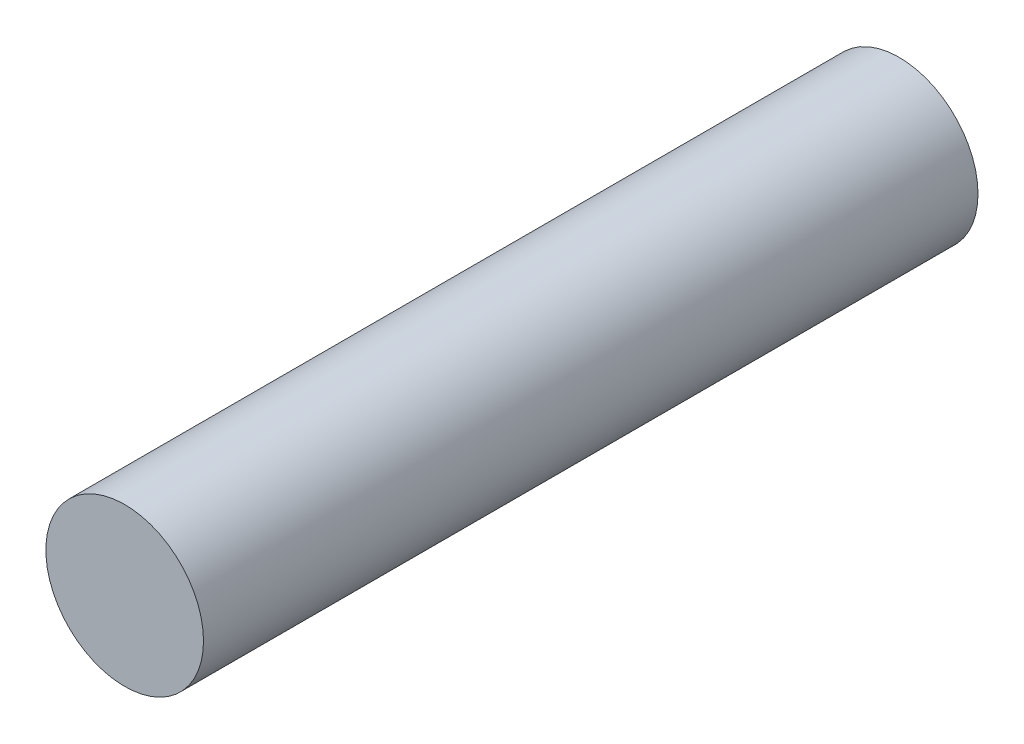
ISO-10303-21;
HEADER;
FILE_DESCRIPTION(('STEP AP214'),'2;1');
FILE_NAME('part.step','',(''),(''),'','','');
FILE_SCHEMA(('AUTOMOTIVE_DESIGN { 1 0 10303 214 1 1 1 1 }'));
ENDSEC;
DATA;
#1=APPLICATION_CONTEXT('core data for automotive mechanical design processes');
#2=APPLICATION_PROTOCOL_DEFINITION('international standard','automotive_design',2000,#1);
#3=PRODUCT_CONTEXT('',#1,'mechanical');
#4=PRODUCT('Part','Part','',(#3));
#5=PRODUCT_RELATED_PRODUCT_CATEGORY('part','',(#4));
#6=PRODUCT_DEFINITION_FORMATION('','',#4);
#7=PRODUCT_DEFINITION_CONTEXT('part definition',#1,'design');
#8=PRODUCT_DEFINITION('design','',#6,#7);
#9=PRODUCT_DEFINITION_SHAPE('','',#8);
#10=(LENGTH_UNIT() NAMED_UNIT(*) SI_UNIT(.MILLI.,.METRE.));
#11=(NAMED_UNIT(*) PLANE_ANGLE_UNIT() SI_UNIT($,.RADIAN.));
#12=(NAMED_UNIT(*) SI_UNIT($,.STERADIAN.) SOLID_ANGLE_UNIT());
#13=UNCERTAINTY_MEASURE_WITH_UNIT(LENGTH_MEASURE(1.E-05),#10,'distance_accuracy_value','');
#14=(GEOMETRIC_REPRESENTATION_CONTEXT(3) GLOBAL_UNCERTAINTY_ASSIGNED_CONTEXT((#13)) GLOBAL_UNIT_ASSIGNED_CONTEXT((#10,
#11,#12)) REPRESENTATION_CONTEXT('',''));
#15=CARTESIAN_POINT('',(0.,0.,0.));
#16=DIRECTION('',(0.,0.,1.));
#17=DIRECTION('',(1.,0.,0.));
#18=AXIS2_PLACEMENT_3D('',#15,#16,#17);
#19=CARTESIAN_POINT('',(0.,0.,19.65));
#20=DIRECTION('',(0.,0.,-1.));
#21=DIRECTION('',(-1.,0.,0.));
#22=AXIS2_PLACEMENT_3D('',#19,#20,#21);
#23=CYLINDRICAL_SURFACE('',#22,2.);
#24=CARTESIAN_POINT('',(0.,0.,19.65));
#25=DIRECTION('',(0.,0.,1.));
#26=DIRECTION('',(1.,0.,0.));
#27=AXIS2_PLACEMENT_3D('',#24,#25,#26);
#28=CIRCLE('',#27,2.);
#29=CARTESIAN_POINT('',(2.,0.,19.65));
#30=VERTEX_POINT('',#29);
#31=EDGE_CURVE('E10',#30,#30,#28,.T.);
#32=ORIENTED_EDGE('',*,*,#31,.F.);
#33=EDGE_LOOP('',(#32));
#34=FACE_BOUND('',#33,.T.);
#35=CARTESIAN_POINT('',(0.,0.,0.));
#36=DIRECTION('',(0.,0.,1.));
#37=DIRECTION('',(1.,0.,0.));
#38=AXIS2_PLACEMENT_3D('',#35,#36,#37);
#39=CIRCLE('',#38,2.);
#40=CARTESIAN_POINT('',(2.,0.,0.));
#41=VERTEX_POINT('',#40);
#42=EDGE_CURVE('E34',#41,#41,#39,.T.);
#43=ORIENTED_EDGE('',*,*,#42,.T.);
#44=EDGE_LOOP('',(#43));
#45=FACE_BOUND('',#44,.T.);
#46=ADVANCED_FACE('F31',(#34,#45),#23,.T.);
#47=CARTESIAN_POINT('',(0.,0.,19.65));
#48=DIRECTION('',(0.,0.,1.));
#49=DIRECTION('',(1.,0.,0.));
#50=AXIS2_PLACEMENT_3D('',#47,#48,#49);
#51=PLANE('',#50);
#52=ORIENTED_EDGE('',*,*,#31,.T.);
#53=EDGE_LOOP('',(#52));
#54=FACE_BOUND('',#53,.T.);
#55=ADVANCED_FACE('F46',(#54),#51,.T.);
#56=CARTESIAN_POINT('',(0.,0.,0.));
#57=DIRECTION('',(0.,0.,1.));
#58=DIRECTION('',(1.,0.,0.));
#59=AXIS2_PLACEMENT_3D('',#56,#57,#58);
#60=PLANE('',#59);
#61=ORIENTED_EDGE('',*,*,#42,.F.);
#62=EDGE_LOOP('',(#61));
#63=FACE_BOUND('',#62,.T.);
#64=ADVANCED_FACE('F44',(#63),#60,.F.);
#65=CLOSED_SHELL('',(#46,#55,#64));
#66=MANIFOLD_SOLID_BREP('B2',#65);
#67=ADVANCED_BREP_SHAPE_REPRESENTATION('',(#18,#66),#14);
#68=SHAPE_DEFINITION_REPRESENTATION(#9,#67);
ENDSEC;
END-ISO-10303-21;
